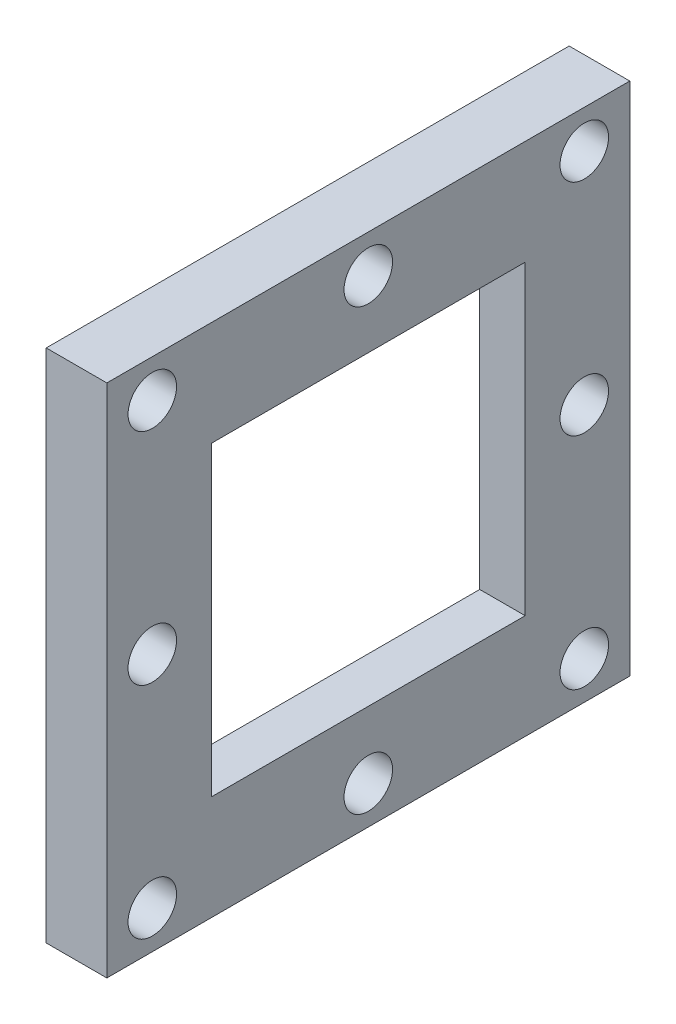
ISO-10303-21;
HEADER;
FILE_DESCRIPTION(('STEP AP214'),'2;1');
FILE_NAME('part.step','',(''),(''),'','','');
FILE_SCHEMA(('AUTOMOTIVE_DESIGN { 1 0 10303 214 1 1 1 1 }'));
ENDSEC;
DATA;
#1=APPLICATION_CONTEXT('core data for automotive mechanical design processes');
#2=APPLICATION_PROTOCOL_DEFINITION('international standard','automotive_design',2000,#1);
#3=PRODUCT_CONTEXT('',#1,'mechanical');
#4=PRODUCT('Part','Part','',(#3));
#5=PRODUCT_RELATED_PRODUCT_CATEGORY('part','',(#4));
#6=PRODUCT_DEFINITION_FORMATION('','',#4);
#7=PRODUCT_DEFINITION_CONTEXT('part definition',#1,'design');
#8=PRODUCT_DEFINITION('design','',#6,#7);
#9=PRODUCT_DEFINITION_SHAPE('','',#8);
#10=(LENGTH_UNIT() NAMED_UNIT(*) SI_UNIT(.MILLI.,.METRE.));
#11=(NAMED_UNIT(*) PLANE_ANGLE_UNIT() SI_UNIT($,.RADIAN.));
#12=(NAMED_UNIT(*) SI_UNIT($,.STERADIAN.) SOLID_ANGLE_UNIT());
#13=UNCERTAINTY_MEASURE_WITH_UNIT(LENGTH_MEASURE(1.E-05),#10,'distance_accuracy_value','');
#14=(GEOMETRIC_REPRESENTATION_CONTEXT(3) GLOBAL_UNCERTAINTY_ASSIGNED_CONTEXT((#13)) GLOBAL_UNIT_ASSIGNED_CONTEXT((#10,
#11,#12)) REPRESENTATION_CONTEXT('',''));
#15=CARTESIAN_POINT('',(0.,0.,0.));
#16=DIRECTION('',(0.,0.,1.));
#17=DIRECTION('',(1.,0.,0.));
#18=AXIS2_PLACEMENT_3D('',#15,#16,#17);
#19=CARTESIAN_POINT('',(1.,6.9,-6.9));
#20=DIRECTION('',(0.707106781186548,-0.707106781186548,0.));
#21=DIRECTION('',(0.707106781186548,0.707106781186548,0.));
#22=AXIS2_PLACEMENT_3D('',#19,#20,#21);
#23=PLANE('',#22);
#24=DIRECTION('',(0.577350269189625,0.577350269189627,-0.577350269189625));
#25=VECTOR('',#24,1.);
#26=CARTESIAN_POINT('',(0.,5.90000000000001,28.6));
#27=LINE('',#26,#25);
#28=CARTESIAN_POINT('',(0.,5.9,28.6));
#29=VERTEX_POINT('',#28);
#30=CARTESIAN_POINT('',(1.,6.9,27.6));
#31=VERTEX_POINT('',#30);
#32=EDGE_CURVE('E124',#29,#31,#27,.T.);
#33=ORIENTED_EDGE('',*,*,#32,.T.);
#34=DIRECTION('',(0.,0.,-1.));
#35=VECTOR('',#34,1.);
#36=CARTESIAN_POINT('',(1.,6.9,27.6));
#37=LINE('',#36,#35);
#38=CARTESIAN_POINT('',(1.,6.9,6.90000000000001));
#39=VERTEX_POINT('',#38);
#40=EDGE_CURVE('E102',#31,#39,#37,.T.);
#41=ORIENTED_EDGE('',*,*,#40,.T.);
#42=DIRECTION('',(-0.577350269189626,-0.577350269189626,-0.577350269189626));
#43=VECTOR('',#42,1.);
#44=CARTESIAN_POINT('',(1.,6.89999999999999,6.9));
#45=LINE('',#44,#43);
#46=CARTESIAN_POINT('',(0.,5.89999999999999,5.9));
#47=VERTEX_POINT('',#46);
#48=EDGE_CURVE('E97',#39,#47,#45,.T.);
#49=ORIENTED_EDGE('',*,*,#48,.T.);
#50=DIRECTION('',(0.,0.,-1.));
#51=VECTOR('',#50,1.);
#52=CARTESIAN_POINT('',(0.,5.9,0.));
#53=LINE('',#52,#51);
#54=EDGE_CURVE('E99',#47,#29,#53,.F.);
#55=ORIENTED_EDGE('',*,*,#54,.T.);
#56=EDGE_LOOP('',(#33,#41,#49,#55));
#57=FACE_BOUND('',#56,.T.);
#58=ADVANCED_FACE('F17',(#57),#23,.F.);
#59=CARTESIAN_POINT('',(1.,-6.8,27.6));
#60=DIRECTION('',(0.707106781186548,0.,0.707106781186548));
#61=DIRECTION('',(0.707106781186548,0.,-0.707106781186548));
#62=AXIS2_PLACEMENT_3D('',#59,#60,#61);
#63=PLANE('',#62);
#64=DIRECTION('',(0.577350269189626,-0.577350269189626,-0.577350269189624));
#65=VECTOR('',#64,1.);
#66=CARTESIAN_POINT('',(0.,28.1,28.6));
#67=LINE('',#66,#65);
#68=CARTESIAN_POINT('',(0.,28.1,28.6));
#69=VERTEX_POINT('',#68);
#70=CARTESIAN_POINT('',(0.999999999999999,27.1,27.6));
#71=VERTEX_POINT('',#70);
#72=EDGE_CURVE('E122',#69,#71,#67,.T.);
#73=ORIENTED_EDGE('',*,*,#72,.T.);
#74=DIRECTION('',(0.,1.,0.));
#75=VECTOR('',#74,1.);
#76=CARTESIAN_POINT('',(1.,27.1,27.6));
#77=LINE('',#76,#75);
#78=EDGE_CURVE('E212',#71,#31,#77,.F.);
#79=ORIENTED_EDGE('',*,*,#78,.T.);
#80=ORIENTED_EDGE('',*,*,#32,.F.);
#81=DIRECTION('',(0.,1.,0.));
#82=VECTOR('',#81,1.);
#83=CARTESIAN_POINT('',(0.,0.,28.6));
#84=LINE('',#83,#82);
#85=EDGE_CURVE('E115',#29,#69,#84,.T.);
#86=ORIENTED_EDGE('',*,*,#85,.T.);
#87=EDGE_LOOP('',(#73,#79,#80,#86));
#88=FACE_BOUND('',#87,.T.);
#89=ADVANCED_FACE('F211',(#88),#63,.F.);
#90=CARTESIAN_POINT('',(1.,27.1,41.4));
#91=DIRECTION('',(0.707106781186548,0.707106781186548,0.));
#92=DIRECTION('',(-0.707106781186548,0.707106781186548,0.));
#93=AXIS2_PLACEMENT_3D('',#90,#91,#92);
#94=PLANE('',#93);
#95=DIRECTION('',(0.577350269189626,-0.577350269189626,0.577350269189626));
#96=VECTOR('',#95,1.);
#97=CARTESIAN_POINT('',(0.,28.1,5.9));
#98=LINE('',#97,#96);
#99=CARTESIAN_POINT('',(0.,28.1,5.9));
#100=VERTEX_POINT('',#99);
#101=CARTESIAN_POINT('',(1.,27.1,6.89999999999999));
#102=VERTEX_POINT('',#101);
#103=EDGE_CURVE('E92',#100,#102,#98,.T.);
#104=ORIENTED_EDGE('',*,*,#103,.T.);
#105=DIRECTION('',(0.,0.,1.));
#106=VECTOR('',#105,1.);
#107=CARTESIAN_POINT('',(1.,27.1,6.9));
#108=LINE('',#107,#106);
#109=EDGE_CURVE('E206',#102,#71,#108,.T.);
#110=ORIENTED_EDGE('',*,*,#109,.T.);
#111=ORIENTED_EDGE('',*,*,#72,.F.);
#112=DIRECTION('',(0.,0.,-1.));
#113=VECTOR('',#112,1.);
#114=CARTESIAN_POINT('',(0.,28.1,0.));
#115=LINE('',#114,#113);
#116=EDGE_CURVE('E117',#69,#100,#115,.T.);
#117=ORIENTED_EDGE('',*,*,#116,.T.);
#118=EDGE_LOOP('',(#104,#110,#111,#117));
#119=FACE_BOUND('',#118,.T.);
#120=ADVANCED_FACE('F204',(#119),#94,.F.);
#121=CARTESIAN_POINT('',(1.,40.8,6.9));
#122=DIRECTION('',(0.707106781186548,0.,-0.707106781186548));
#123=DIRECTION('',(-0.707106781186548,0.,-0.707106781186548));
#124=AXIS2_PLACEMENT_3D('',#121,#122,#123);
#125=PLANE('',#124);
#126=ORIENTED_EDGE('',*,*,#48,.F.);
#127=DIRECTION('',(0.,1.,0.));
#128=VECTOR('',#127,1.);
#129=CARTESIAN_POINT('',(1.,6.9,6.9));
#130=LINE('',#129,#128);
#131=EDGE_CURVE('E162',#39,#102,#130,.T.);
#132=ORIENTED_EDGE('',*,*,#131,.T.);
#133=ORIENTED_EDGE('',*,*,#103,.F.);
#134=DIRECTION('',(0.,1.,0.));
#135=VECTOR('',#134,1.);
#136=CARTESIAN_POINT('',(0.,0.,5.9));
#137=LINE('',#136,#135);
#138=EDGE_CURVE('E105',#100,#47,#137,.F.);
#139=ORIENTED_EDGE('',*,*,#138,.T.);
#140=EDGE_LOOP('',(#126,#132,#133,#139));
#141=FACE_BOUND('',#140,.T.);
#142=ADVANCED_FACE('F108',(#141),#125,.F.);
#143=CARTESIAN_POINT('',(0.,0.,0.));
#144=DIRECTION('',(1.,0.,0.));
#145=DIRECTION('',(0.,0.,-1.));
#146=AXIS2_PLACEMENT_3D('',#143,#144,#145);
#147=PLANE('',#146);
#148=CARTESIAN_POINT('',(0.,31.5,3.));
#149=DIRECTION('',(-1.,0.,0.));
#150=DIRECTION('',(0.,0.,1.));
#151=AXIS2_PLACEMENT_3D('',#148,#149,#150);
#152=CIRCLE('',#151,1.6);
#153=CARTESIAN_POINT('',(0.,31.5,4.6));
#154=VERTEX_POINT('',#153);
#155=EDGE_CURVE('E149',#154,#154,#152,.F.);
#156=ORIENTED_EDGE('',*,*,#155,.T.);
#157=EDGE_LOOP('',(#156));
#158=FACE_BOUND('',#157,.T.);
#159=CARTESIAN_POINT('',(0.,31.5,17.25));
#160=DIRECTION('',(-1.,0.,0.));
#161=DIRECTION('',(0.,0.,1.));
#162=AXIS2_PLACEMENT_3D('',#159,#160,#161);
#163=CIRCLE('',#162,1.6);
#164=CARTESIAN_POINT('',(0.,31.5,18.85));
#165=VERTEX_POINT('',#164);
#166=EDGE_CURVE('E153',#165,#165,#163,.F.);
#167=ORIENTED_EDGE('',*,*,#166,.T.);
#168=EDGE_LOOP('',(#167));
#169=FACE_BOUND('',#168,.T.);
#170=CARTESIAN_POINT('',(0.,31.5,31.5));
#171=DIRECTION('',(-1.,0.,0.));
#172=DIRECTION('',(0.,0.,1.));
#173=AXIS2_PLACEMENT_3D('',#170,#171,#172);
#174=CIRCLE('',#173,1.6);
#175=CARTESIAN_POINT('',(0.,31.5,33.1));
#176=VERTEX_POINT('',#175);
#177=EDGE_CURVE('E156',#176,#176,#174,.F.);
#178=ORIENTED_EDGE('',*,*,#177,.T.);
#179=EDGE_LOOP('',(#178));
#180=FACE_BOUND('',#179,.T.);
#181=CARTESIAN_POINT('',(0.,2.5,3.));
#182=DIRECTION('',(-1.,0.,0.));
#183=DIRECTION('',(0.,0.,1.));
#184=AXIS2_PLACEMENT_3D('',#181,#182,#183);
#185=CIRCLE('',#184,1.6);
#186=CARTESIAN_POINT('',(0.,2.5,4.6));
#187=VERTEX_POINT('',#186);
#188=EDGE_CURVE('E159',#187,#187,#185,.F.);
#189=ORIENTED_EDGE('',*,*,#188,.T.);
#190=EDGE_LOOP('',(#189));
#191=FACE_BOUND('',#190,.T.);
#192=CARTESIAN_POINT('',(0.,2.5,31.5));
#193=DIRECTION('',(-1.,0.,0.));
#194=DIRECTION('',(0.,0.,1.));
#195=AXIS2_PLACEMENT_3D('',#192,#193,#194);
#196=CIRCLE('',#195,1.6);
#197=CARTESIAN_POINT('',(0.,2.5,33.1));
#198=VERTEX_POINT('',#197);
#199=EDGE_CURVE('E163',#198,#198,#196,.F.);
#200=ORIENTED_EDGE('',*,*,#199,.T.);
#201=EDGE_LOOP('',(#200));
#202=FACE_BOUND('',#201,.T.);
#203=CARTESIAN_POINT('',(0.,2.5,17.25));
#204=DIRECTION('',(-1.,0.,0.));
#205=DIRECTION('',(0.,0.,1.));
#206=AXIS2_PLACEMENT_3D('',#203,#204,#205);
#207=CIRCLE('',#206,1.6);
#208=CARTESIAN_POINT('',(0.,2.5,18.85));
#209=VERTEX_POINT('',#208);
#210=EDGE_CURVE('E166',#209,#209,#207,.F.);
#211=ORIENTED_EDGE('',*,*,#210,.T.);
#212=EDGE_LOOP('',(#211));
#213=FACE_BOUND('',#212,.T.);
#214=CARTESIAN_POINT('',(0.,17.,31.5));
#215=DIRECTION('',(-1.,0.,0.));
#216=DIRECTION('',(0.,0.,1.));
#217=AXIS2_PLACEMENT_3D('',#214,#215,#216);
#218=CIRCLE('',#217,1.6);
#219=CARTESIAN_POINT('',(0.,17.,33.1));
#220=VERTEX_POINT('',#219);
#221=EDGE_CURVE('E168',#220,#220,#218,.F.);
#222=ORIENTED_EDGE('',*,*,#221,.T.);
#223=EDGE_LOOP('',(#222));
#224=FACE_BOUND('',#223,.T.);
#225=CARTESIAN_POINT('',(0.,17.,3.));
#226=DIRECTION('',(-1.,0.,0.));
#227=DIRECTION('',(0.,0.,1.));
#228=AXIS2_PLACEMENT_3D('',#225,#226,#227);
#229=CIRCLE('',#228,1.6);
#230=CARTESIAN_POINT('',(0.,17.,4.6));
#231=VERTEX_POINT('',#230);
#232=EDGE_CURVE('E20',#231,#231,#229,.F.);
#233=ORIENTED_EDGE('',*,*,#232,.T.);
#234=EDGE_LOOP('',(#233));
#235=FACE_BOUND('',#234,.T.);
#236=ORIENTED_EDGE('',*,*,#85,.F.);
#237=ORIENTED_EDGE('',*,*,#54,.F.);
#238=ORIENTED_EDGE('',*,*,#138,.F.);
#239=ORIENTED_EDGE('',*,*,#116,.F.);
#240=EDGE_LOOP('',(#236,#237,#238,#239));
#241=FACE_BOUND('',#240,.T.);
#242=DIRECTION('',(0.,1.,0.));
#243=VECTOR('',#242,1.);
#244=CARTESIAN_POINT('',(0.,34.,34.5));
#245=LINE('',#244,#243);
#246=CARTESIAN_POINT('',(0.,34.,34.5));
#247=VERTEX_POINT('',#246);
#248=CARTESIAN_POINT('',(0.,0.,34.5));
#249=VERTEX_POINT('',#248);
#250=EDGE_CURVE('E191',#247,#249,#245,.F.);
#251=ORIENTED_EDGE('',*,*,#250,.F.);
#252=DIRECTION('',(0.,0.,1.));
#253=VECTOR('',#252,1.);
#254=CARTESIAN_POINT('',(0.,34.,0.));
#255=LINE('',#254,#253);
#256=CARTESIAN_POINT('',(0.,34.,0.));
#257=VERTEX_POINT('',#256);
#258=EDGE_CURVE('E196',#257,#247,#255,.T.);
#259=ORIENTED_EDGE('',*,*,#258,.F.);
#260=DIRECTION('',(0.,1.,0.));
#261=VECTOR('',#260,1.);
#262=CARTESIAN_POINT('',(0.,0.,0.));
#263=LINE('',#262,#261);
#264=CARTESIAN_POINT('',(0.,0.,0.));
#265=VERTEX_POINT('',#264);
#266=EDGE_CURVE('E201',#265,#257,#263,.T.);
#267=ORIENTED_EDGE('',*,*,#266,.F.);
#268=DIRECTION('',(0.,0.,-1.));
#269=VECTOR('',#268,1.);
#270=CARTESIAN_POINT('',(0.,0.,34.5));
#271=LINE('',#270,#269);
#272=EDGE_CURVE('E177',#249,#265,#271,.T.);
#273=ORIENTED_EDGE('',*,*,#272,.F.);
#274=EDGE_LOOP('',(#251,#259,#267,#273));
#275=FACE_BOUND('',#274,.T.);
#276=ADVANCED_FACE('F113',(#158,#169,#180,#191,#202,#213,#224,#235,#241,#275),#147,.F.);
#277=CARTESIAN_POINT('',(0.,0.,0.));
#278=DIRECTION('',(0.,0.,-1.));
#279=DIRECTION('',(-1.,0.,0.));
#280=AXIS2_PLACEMENT_3D('',#277,#278,#279);
#281=PLANE('',#280);
#282=DIRECTION('',(1.,0.,0.));
#283=VECTOR('',#282,1.);
#284=CARTESIAN_POINT('',(0.,34.,0.));
#285=LINE('',#284,#283);
#286=CARTESIAN_POINT('',(4.,34.,0.));
#287=VERTEX_POINT('',#286);
#288=EDGE_CURVE('E198',#287,#257,#285,.F.);
#289=ORIENTED_EDGE('',*,*,#288,.F.);
#290=DIRECTION('',(0.,1.,0.));
#291=VECTOR('',#290,1.);
#292=CARTESIAN_POINT('',(4.,0.,0.));
#293=LINE('',#292,#291);
#294=CARTESIAN_POINT('',(4.,0.,0.));
#295=VERTEX_POINT('',#294);
#296=EDGE_CURVE('E152',#295,#287,#293,.T.);
#297=ORIENTED_EDGE('',*,*,#296,.F.);
#298=DIRECTION('',(1.,0.,0.));
#299=VECTOR('',#298,1.);
#300=CARTESIAN_POINT('',(0.,0.,0.));
#301=LINE('',#300,#299);
#302=EDGE_CURVE('E173',#265,#295,#301,.T.);
#303=ORIENTED_EDGE('',*,*,#302,.F.);
#304=ORIENTED_EDGE('',*,*,#266,.T.);
#305=EDGE_LOOP('',(#289,#297,#303,#304));
#306=FACE_BOUND('',#305,.T.);
#307=ADVANCED_FACE('F404',(#306),#281,.T.);
#308=CARTESIAN_POINT('',(0.,34.,0.));
#309=DIRECTION('',(0.,1.,0.));
#310=DIRECTION('',(0.,0.,1.));
#311=AXIS2_PLACEMENT_3D('',#308,#309,#310);
#312=PLANE('',#311);
#313=DIRECTION('',(1.,0.,0.));
#314=VECTOR('',#313,1.);
#315=CARTESIAN_POINT('',(0.,34.,34.5));
#316=LINE('',#315,#314);
#317=CARTESIAN_POINT('',(4.,34.,34.5));
#318=VERTEX_POINT('',#317);
#319=EDGE_CURVE('E193',#318,#247,#316,.F.);
#320=ORIENTED_EDGE('',*,*,#319,.F.);
#321=DIRECTION('',(0.,0.,-1.));
#322=VECTOR('',#321,1.);
#323=CARTESIAN_POINT('',(4.,34.,0.));
#324=LINE('',#323,#322);
#325=EDGE_CURVE('E229',#287,#318,#324,.F.);
#326=ORIENTED_EDGE('',*,*,#325,.F.);
#327=ORIENTED_EDGE('',*,*,#288,.T.);
#328=ORIENTED_EDGE('',*,*,#258,.T.);
#329=EDGE_LOOP('',(#320,#326,#327,#328));
#330=FACE_BOUND('',#329,.T.);
#331=ADVANCED_FACE('F395',(#330),#312,.T.);
#332=CARTESIAN_POINT('',(0.,34.,34.5));
#333=DIRECTION('',(0.,0.,1.));
#334=DIRECTION('',(1.,0.,0.));
#335=AXIS2_PLACEMENT_3D('',#332,#333,#334);
#336=PLANE('',#335);
#337=DIRECTION('',(1.,0.,0.));
#338=VECTOR('',#337,1.);
#339=CARTESIAN_POINT('',(0.,0.,34.5));
#340=LINE('',#339,#338);
#341=CARTESIAN_POINT('',(4.,0.,34.5));
#342=VERTEX_POINT('',#341);
#343=EDGE_CURVE('E184',#342,#249,#340,.F.);
#344=ORIENTED_EDGE('',*,*,#343,.F.);
#345=DIRECTION('',(0.,1.,0.));
#346=VECTOR('',#345,1.);
#347=CARTESIAN_POINT('',(4.,0.,34.5));
#348=LINE('',#347,#346);
#349=EDGE_CURVE('E232',#318,#342,#348,.F.);
#350=ORIENTED_EDGE('',*,*,#349,.F.);
#351=ORIENTED_EDGE('',*,*,#319,.T.);
#352=ORIENTED_EDGE('',*,*,#250,.T.);
#353=EDGE_LOOP('',(#344,#350,#351,#352));
#354=FACE_BOUND('',#353,.T.);
#355=ADVANCED_FACE('F387',(#354),#336,.T.);
#356=CARTESIAN_POINT('',(0.,0.,34.5));
#357=DIRECTION('',(0.,-1.,0.));
#358=DIRECTION('',(0.,0.,-1.));
#359=AXIS2_PLACEMENT_3D('',#356,#357,#358);
#360=PLANE('',#359);
#361=ORIENTED_EDGE('',*,*,#302,.T.);
#362=DIRECTION('',(0.,0.,-1.));
#363=VECTOR('',#362,1.);
#364=CARTESIAN_POINT('',(4.,0.,0.));
#365=LINE('',#364,#363);
#366=EDGE_CURVE('E148',#342,#295,#365,.T.);
#367=ORIENTED_EDGE('',*,*,#366,.F.);
#368=ORIENTED_EDGE('',*,*,#343,.T.);
#369=ORIENTED_EDGE('',*,*,#272,.T.);
#370=EDGE_LOOP('',(#361,#367,#368,#369));
#371=FACE_BOUND('',#370,.T.);
#372=ADVANCED_FACE('F378',(#371),#360,.T.);
#373=CARTESIAN_POINT('',(3.9,17.,3.));
#374=DIRECTION('',(-1.,0.,0.));
#375=DIRECTION('',(0.,0.,1.));
#376=AXIS2_PLACEMENT_3D('',#373,#374,#375);
#377=CYLINDRICAL_SURFACE('',#376,1.6);
#378=ORIENTED_EDGE('',*,*,#232,.F.);
#379=EDGE_LOOP('',(#378));
#380=FACE_BOUND('',#379,.T.);
#381=CARTESIAN_POINT('',(4.,17.,3.));
#382=DIRECTION('',(-1.,0.,0.));
#383=DIRECTION('',(0.,0.,1.));
#384=AXIS2_PLACEMENT_3D('',#381,#382,#383);
#385=CIRCLE('',#384,1.6);
#386=CARTESIAN_POINT('',(4.,17.,4.6));
#387=VERTEX_POINT('',#386);
#388=EDGE_CURVE('E145',#387,#387,#385,.T.);
#389=ORIENTED_EDGE('',*,*,#388,.F.);
#390=EDGE_LOOP('',(#389));
#391=FACE_BOUND('',#390,.T.);
#392=ADVANCED_FACE('F369',(#380,#391),#377,.F.);
#393=CARTESIAN_POINT('',(3.9,17.,31.5));
#394=DIRECTION('',(-1.,0.,0.));
#395=DIRECTION('',(0.,0.,1.));
#396=AXIS2_PLACEMENT_3D('',#393,#394,#395);
#397=CYLINDRICAL_SURFACE('',#396,1.6);
#398=ORIENTED_EDGE('',*,*,#221,.F.);
#399=EDGE_LOOP('',(#398));
#400=FACE_BOUND('',#399,.T.);
#401=CARTESIAN_POINT('',(4.,17.,31.5));
#402=DIRECTION('',(-1.,0.,0.));
#403=DIRECTION('',(0.,0.,1.));
#404=AXIS2_PLACEMENT_3D('',#401,#402,#403);
#405=CIRCLE('',#404,1.6);
#406=CARTESIAN_POINT('',(4.,17.,33.1));
#407=VERTEX_POINT('',#406);
#408=EDGE_CURVE('E142',#407,#407,#405,.T.);
#409=ORIENTED_EDGE('',*,*,#408,.F.);
#410=EDGE_LOOP('',(#409));
#411=FACE_BOUND('',#410,.T.);
#412=ADVANCED_FACE('F360',(#400,#411),#397,.F.);
#413=CARTESIAN_POINT('',(3.9,2.5,17.25));
#414=DIRECTION('',(-1.,0.,0.));
#415=DIRECTION('',(0.,0.,1.));
#416=AXIS2_PLACEMENT_3D('',#413,#414,#415);
#417=CYLINDRICAL_SURFACE('',#416,1.6);
#418=ORIENTED_EDGE('',*,*,#210,.F.);
#419=EDGE_LOOP('',(#418));
#420=FACE_BOUND('',#419,.T.);
#421=CARTESIAN_POINT('',(4.,2.5,17.25));
#422=DIRECTION('',(-1.,0.,0.));
#423=DIRECTION('',(0.,0.,1.));
#424=AXIS2_PLACEMENT_3D('',#421,#422,#423);
#425=CIRCLE('',#424,1.6);
#426=CARTESIAN_POINT('',(4.,2.5,18.85));
#427=VERTEX_POINT('',#426);
#428=EDGE_CURVE('E139',#427,#427,#425,.T.);
#429=ORIENTED_EDGE('',*,*,#428,.F.);
#430=EDGE_LOOP('',(#429));
#431=FACE_BOUND('',#430,.T.);
#432=ADVANCED_FACE('F263',(#420,#431),#417,.F.);
#433=CARTESIAN_POINT('',(3.9,2.5,31.5));
#434=DIRECTION('',(-1.,0.,0.));
#435=DIRECTION('',(0.,0.,1.));
#436=AXIS2_PLACEMENT_3D('',#433,#434,#435);
#437=CYLINDRICAL_SURFACE('',#436,1.6);
#438=ORIENTED_EDGE('',*,*,#199,.F.);
#439=EDGE_LOOP('',(#438));
#440=FACE_BOUND('',#439,.T.);
#441=CARTESIAN_POINT('',(4.,2.5,31.5));
#442=DIRECTION('',(-1.,0.,0.));
#443=DIRECTION('',(0.,0.,1.));
#444=AXIS2_PLACEMENT_3D('',#441,#442,#443);
#445=CIRCLE('',#444,1.6);
#446=CARTESIAN_POINT('',(4.,2.5,33.1));
#447=VERTEX_POINT('',#446);
#448=EDGE_CURVE('E135',#447,#447,#445,.T.);
#449=ORIENTED_EDGE('',*,*,#448,.F.);
#450=EDGE_LOOP('',(#449));
#451=FACE_BOUND('',#450,.T.);
#452=ADVANCED_FACE('F254',(#440,#451),#437,.F.);
#453=CARTESIAN_POINT('',(0.,6.9,27.6));
#454=DIRECTION('',(0.,-1.,0.));
#455=DIRECTION('',(0.,0.,-1.));
#456=AXIS2_PLACEMENT_3D('',#453,#454,#455);
#457=PLANE('',#456);
#458=DIRECTION('',(1.,0.,0.));
#459=VECTOR('',#458,1.);
#460=CARTESIAN_POINT('',(0.,6.9,27.6));
#461=LINE('',#460,#459);
#462=CARTESIAN_POINT('',(4.,6.9,27.6));
#463=VERTEX_POINT('',#462);
#464=EDGE_CURVE('E218',#31,#463,#461,.T.);
#465=ORIENTED_EDGE('',*,*,#464,.T.);
#466=DIRECTION('',(0.,0.,-1.));
#467=VECTOR('',#466,1.);
#468=CARTESIAN_POINT('',(4.,6.9,0.));
#469=LINE('',#468,#467);
#470=CARTESIAN_POINT('',(4.,6.9,6.9));
#471=VERTEX_POINT('',#470);
#472=EDGE_CURVE('E138',#471,#463,#469,.F.);
#473=ORIENTED_EDGE('',*,*,#472,.F.);
#474=DIRECTION('',(-1.,0.,0.));
#475=VECTOR('',#474,1.);
#476=CARTESIAN_POINT('',(0.,6.9,6.9));
#477=LINE('',#476,#475);
#478=EDGE_CURVE('E224',#471,#39,#477,.T.);
#479=ORIENTED_EDGE('',*,*,#478,.T.);
#480=ORIENTED_EDGE('',*,*,#40,.F.);
#481=EDGE_LOOP('',(#465,#473,#479,#480));
#482=FACE_BOUND('',#481,.T.);
#483=ADVANCED_FACE('F252',(#482),#457,.F.);
#484=CARTESIAN_POINT('',(0.,27.1,27.6));
#485=DIRECTION('',(0.,0.,1.));
#486=DIRECTION('',(1.,0.,0.));
#487=AXIS2_PLACEMENT_3D('',#484,#485,#486);
#488=PLANE('',#487);
#489=DIRECTION('',(1.,0.,0.));
#490=VECTOR('',#489,1.);
#491=CARTESIAN_POINT('',(0.,27.1,27.6));
#492=LINE('',#491,#490);
#493=CARTESIAN_POINT('',(4.,27.1,27.6));
#494=VERTEX_POINT('',#493);
#495=EDGE_CURVE('E217',#71,#494,#492,.T.);
#496=ORIENTED_EDGE('',*,*,#495,.T.);
#497=DIRECTION('',(0.,1.,0.));
#498=VECTOR('',#497,1.);
#499=CARTESIAN_POINT('',(4.,0.,27.6));
#500=LINE('',#499,#498);
#501=EDGE_CURVE('E238',#463,#494,#500,.T.);
#502=ORIENTED_EDGE('',*,*,#501,.F.);
#503=ORIENTED_EDGE('',*,*,#464,.F.);
#504=ORIENTED_EDGE('',*,*,#78,.F.);
#505=EDGE_LOOP('',(#496,#502,#503,#504));
#506=FACE_BOUND('',#505,.T.);
#507=ADVANCED_FACE('F215',(#506),#488,.F.);
#508=CARTESIAN_POINT('',(0.,27.1,6.9));
#509=DIRECTION('',(0.,1.,0.));
#510=DIRECTION('',(0.,0.,1.));
#511=AXIS2_PLACEMENT_3D('',#508,#509,#510);
#512=PLANE('',#511);
#513=DIRECTION('',(-1.,0.,0.));
#514=VECTOR('',#513,1.);
#515=CARTESIAN_POINT('',(0.,27.1,6.9));
#516=LINE('',#515,#514);
#517=CARTESIAN_POINT('',(4.,27.1,6.9));
#518=VERTEX_POINT('',#517);
#519=EDGE_CURVE('E35',#102,#518,#516,.F.);
#520=ORIENTED_EDGE('',*,*,#519,.T.);
#521=DIRECTION('',(0.,0.,-1.));
#522=VECTOR('',#521,1.);
#523=CARTESIAN_POINT('',(4.,27.1,0.));
#524=LINE('',#523,#522);
#525=EDGE_CURVE('E241',#494,#518,#524,.T.);
#526=ORIENTED_EDGE('',*,*,#525,.F.);
#527=ORIENTED_EDGE('',*,*,#495,.F.);
#528=ORIENTED_EDGE('',*,*,#109,.F.);
#529=EDGE_LOOP('',(#520,#526,#527,#528));
#530=FACE_BOUND('',#529,.T.);
#531=ADVANCED_FACE('F261',(#530),#512,.F.);
#532=CARTESIAN_POINT('',(0.,6.9,6.9));
#533=DIRECTION('',(0.,0.,-1.));
#534=DIRECTION('',(-1.,0.,0.));
#535=AXIS2_PLACEMENT_3D('',#532,#533,#534);
#536=PLANE('',#535);
#537=ORIENTED_EDGE('',*,*,#478,.F.);
#538=DIRECTION('',(0.,1.,0.));
#539=VECTOR('',#538,1.);
#540=CARTESIAN_POINT('',(4.,0.,6.9));
#541=LINE('',#540,#539);
#542=EDGE_CURVE('E134',#518,#471,#541,.F.);
#543=ORIENTED_EDGE('',*,*,#542,.F.);
#544=ORIENTED_EDGE('',*,*,#519,.F.);
#545=ORIENTED_EDGE('',*,*,#131,.F.);
#546=EDGE_LOOP('',(#537,#543,#544,#545));
#547=FACE_BOUND('',#546,.T.);
#548=ADVANCED_FACE('F250',(#547),#536,.F.);
#549=CARTESIAN_POINT('',(3.9,2.5,3.));
#550=DIRECTION('',(-1.,0.,0.));
#551=DIRECTION('',(0.,0.,1.));
#552=AXIS2_PLACEMENT_3D('',#549,#550,#551);
#553=CYLINDRICAL_SURFACE('',#552,1.6);
#554=ORIENTED_EDGE('',*,*,#188,.F.);
#555=EDGE_LOOP('',(#554));
#556=FACE_BOUND('',#555,.T.);
#557=CARTESIAN_POINT('',(4.,2.5,3.));
#558=DIRECTION('',(-1.,0.,0.));
#559=DIRECTION('',(0.,0.,1.));
#560=AXIS2_PLACEMENT_3D('',#557,#558,#559);
#561=CIRCLE('',#560,1.6);
#562=CARTESIAN_POINT('',(4.,2.5,4.6));
#563=VERTEX_POINT('',#562);
#564=EDGE_CURVE('E131',#563,#563,#561,.T.);
#565=ORIENTED_EDGE('',*,*,#564,.F.);
#566=EDGE_LOOP('',(#565));
#567=FACE_BOUND('',#566,.T.);
#568=ADVANCED_FACE('F284',(#556,#567),#553,.F.);
#569=CARTESIAN_POINT('',(3.9,31.5,31.5));
#570=DIRECTION('',(-1.,0.,0.));
#571=DIRECTION('',(0.,0.,1.));
#572=AXIS2_PLACEMENT_3D('',#569,#570,#571);
#573=CYLINDRICAL_SURFACE('',#572,1.6);
#574=ORIENTED_EDGE('',*,*,#177,.F.);
#575=EDGE_LOOP('',(#574));
#576=FACE_BOUND('',#575,.T.);
#577=CARTESIAN_POINT('',(4.,31.5,31.5));
#578=DIRECTION('',(-1.,0.,0.));
#579=DIRECTION('',(0.,0.,1.));
#580=AXIS2_PLACEMENT_3D('',#577,#578,#579);
#581=CIRCLE('',#580,1.6);
#582=CARTESIAN_POINT('',(4.,31.5,33.1));
#583=VERTEX_POINT('',#582);
#584=EDGE_CURVE('E128',#583,#583,#581,.T.);
#585=ORIENTED_EDGE('',*,*,#584,.F.);
#586=EDGE_LOOP('',(#585));
#587=FACE_BOUND('',#586,.T.);
#588=ADVANCED_FACE('F280',(#576,#587),#573,.F.);
#589=CARTESIAN_POINT('',(3.9,31.5,17.25));
#590=DIRECTION('',(-1.,0.,0.));
#591=DIRECTION('',(0.,0.,1.));
#592=AXIS2_PLACEMENT_3D('',#589,#590,#591);
#593=CYLINDRICAL_SURFACE('',#592,1.6);
#594=ORIENTED_EDGE('',*,*,#166,.F.);
#595=EDGE_LOOP('',(#594));
#596=FACE_BOUND('',#595,.T.);
#597=CARTESIAN_POINT('',(4.,31.5,17.25));
#598=DIRECTION('',(-1.,0.,0.));
#599=DIRECTION('',(0.,0.,1.));
#600=AXIS2_PLACEMENT_3D('',#597,#598,#599);
#601=CIRCLE('',#600,1.6);
#602=CARTESIAN_POINT('',(4.,31.5,18.85));
#603=VERTEX_POINT('',#602);
#604=EDGE_CURVE('E26',#603,#603,#601,.T.);
#605=ORIENTED_EDGE('',*,*,#604,.F.);
#606=EDGE_LOOP('',(#605));
#607=FACE_BOUND('',#606,.T.);
#608=ADVANCED_FACE('F273',(#596,#607),#593,.F.);
#609=CARTESIAN_POINT('',(3.9,31.5,3.));
#610=DIRECTION('',(-1.,0.,0.));
#611=DIRECTION('',(0.,0.,1.));
#612=AXIS2_PLACEMENT_3D('',#609,#610,#611);
#613=CYLINDRICAL_SURFACE('',#612,1.6);
#614=ORIENTED_EDGE('',*,*,#155,.F.);
#615=EDGE_LOOP('',(#614));
#616=FACE_BOUND('',#615,.T.);
#617=CARTESIAN_POINT('',(4.,31.5,3.));
#618=DIRECTION('',(-1.,0.,0.));
#619=DIRECTION('',(0.,0.,1.));
#620=AXIS2_PLACEMENT_3D('',#617,#618,#619);
#621=CIRCLE('',#620,1.6);
#622=CARTESIAN_POINT('',(4.,31.5,4.6));
#623=VERTEX_POINT('',#622);
#624=EDGE_CURVE('E11',#623,#623,#621,.T.);
#625=ORIENTED_EDGE('',*,*,#624,.F.);
#626=EDGE_LOOP('',(#625));
#627=FACE_BOUND('',#626,.T.);
#628=ADVANCED_FACE('F267',(#616,#627),#613,.F.);
#629=CARTESIAN_POINT('',(4.,0.,0.));
#630=DIRECTION('',(1.,0.,0.));
#631=DIRECTION('',(0.,0.,-1.));
#632=AXIS2_PLACEMENT_3D('',#629,#630,#631);
#633=PLANE('',#632);
#634=ORIENTED_EDGE('',*,*,#624,.T.);
#635=EDGE_LOOP('',(#634));
#636=FACE_BOUND('',#635,.T.);
#637=ORIENTED_EDGE('',*,*,#604,.T.);
#638=EDGE_LOOP('',(#637));
#639=FACE_BOUND('',#638,.T.);
#640=ORIENTED_EDGE('',*,*,#584,.T.);
#641=EDGE_LOOP('',(#640));
#642=FACE_BOUND('',#641,.T.);
#643=ORIENTED_EDGE('',*,*,#564,.T.);
#644=EDGE_LOOP('',(#643));
#645=FACE_BOUND('',#644,.T.);
#646=ORIENTED_EDGE('',*,*,#525,.T.);
#647=ORIENTED_EDGE('',*,*,#542,.T.);
#648=ORIENTED_EDGE('',*,*,#472,.T.);
#649=ORIENTED_EDGE('',*,*,#501,.T.);
#650=EDGE_LOOP('',(#646,#647,#648,#649));
#651=FACE_BOUND('',#650,.T.);
#652=ORIENTED_EDGE('',*,*,#448,.T.);
#653=EDGE_LOOP('',(#652));
#654=FACE_BOUND('',#653,.T.);
#655=ORIENTED_EDGE('',*,*,#428,.T.);
#656=EDGE_LOOP('',(#655));
#657=FACE_BOUND('',#656,.T.);
#658=ORIENTED_EDGE('',*,*,#408,.T.);
#659=EDGE_LOOP('',(#658));
#660=FACE_BOUND('',#659,.T.);
#661=ORIENTED_EDGE('',*,*,#388,.T.);
#662=EDGE_LOOP('',(#661));
#663=FACE_BOUND('',#662,.T.);
#664=ORIENTED_EDGE('',*,*,#349,.T.);
#665=ORIENTED_EDGE('',*,*,#366,.T.);
#666=ORIENTED_EDGE('',*,*,#296,.T.);
#667=ORIENTED_EDGE('',*,*,#325,.T.);
#668=EDGE_LOOP('',(#664,#665,#666,#667));
#669=FACE_BOUND('',#668,.T.);
#670=ADVANCED_FACE('F246',(#636,#639,#642,#645,#651,#654,#657,#660,#663,#669),#633,.T.);
#671=CLOSED_SHELL('',(#58,#89,#120,#142,#276,#307,#331,#355,#372,#392,#412,#432,#452,#483,#507,
#531,#548,#568,#588,#608,#628,#670));
#672=MANIFOLD_SOLID_BREP('B1',#671);
#673=ADVANCED_BREP_SHAPE_REPRESENTATION('',(#18,#672),#14);
#674=SHAPE_DEFINITION_REPRESENTATION(#9,#673);
ENDSEC;
END-ISO-10303-21;
